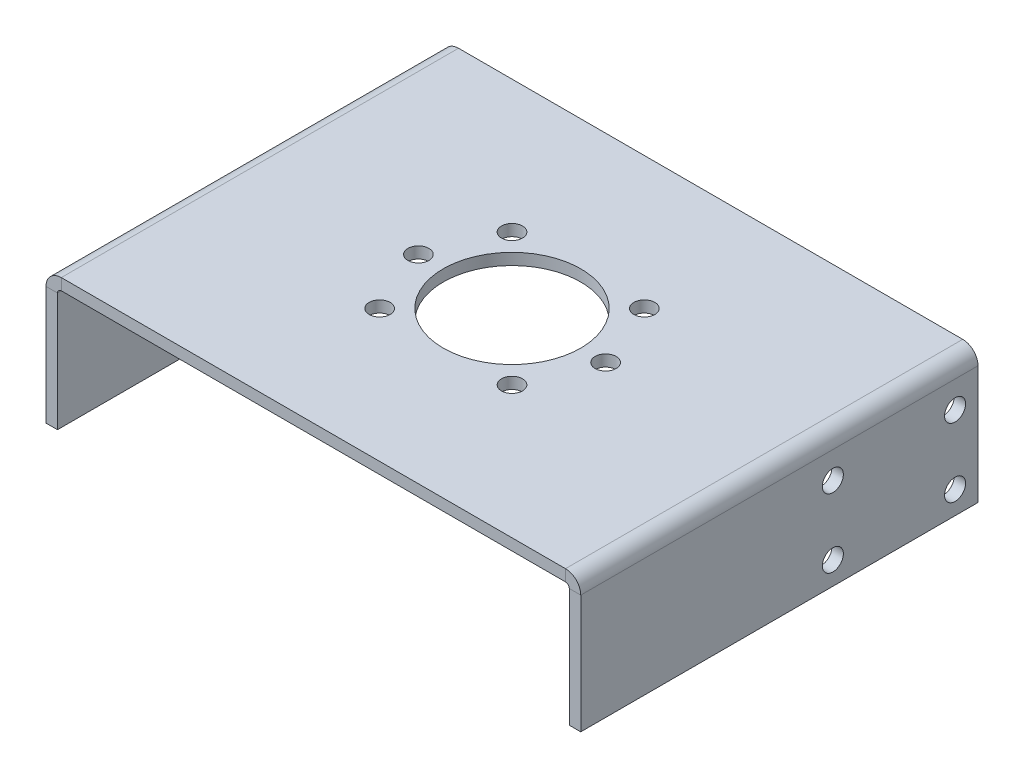
ISO-10303-21;
HEADER;
FILE_DESCRIPTION(('STEP AP214'),'2;1');
FILE_NAME('part.step','',(''),(''),'','','');
FILE_SCHEMA(('AUTOMOTIVE_DESIGN { 1 0 10303 214 1 1 1 1 }'));
ENDSEC;
DATA;
#1=APPLICATION_CONTEXT('core data for automotive mechanical design processes');
#2=APPLICATION_PROTOCOL_DEFINITION('international standard','automotive_design',2000,#1);
#3=PRODUCT_CONTEXT('',#1,'mechanical');
#4=PRODUCT('Part','Part','',(#3));
#5=PRODUCT_RELATED_PRODUCT_CATEGORY('part','',(#4));
#6=PRODUCT_DEFINITION_FORMATION('','',#4);
#7=PRODUCT_DEFINITION_CONTEXT('part definition',#1,'design');
#8=PRODUCT_DEFINITION('design','',#6,#7);
#9=PRODUCT_DEFINITION_SHAPE('','',#8);
#10=(LENGTH_UNIT() NAMED_UNIT(*) SI_UNIT(.MILLI.,.METRE.));
#11=(NAMED_UNIT(*) PLANE_ANGLE_UNIT() SI_UNIT($,.RADIAN.));
#12=(NAMED_UNIT(*) SI_UNIT($,.STERADIAN.) SOLID_ANGLE_UNIT());
#13=UNCERTAINTY_MEASURE_WITH_UNIT(LENGTH_MEASURE(1.E-05),#10,'distance_accuracy_value','');
#14=(GEOMETRIC_REPRESENTATION_CONTEXT(3) GLOBAL_UNCERTAINTY_ASSIGNED_CONTEXT((#13)) GLOBAL_UNIT_ASSIGNED_CONTEXT((#10,
#11,#12)) REPRESENTATION_CONTEXT('',''));
#15=CARTESIAN_POINT('',(0.,0.,0.));
#16=DIRECTION('',(0.,0.,1.));
#17=DIRECTION('',(1.,0.,0.));
#18=AXIS2_PLACEMENT_3D('',#15,#16,#17);
#19=CARTESIAN_POINT('',(-66.,0.,104.));
#20=DIRECTION('',(0.,0.,1.));
#21=DIRECTION('',(1.,0.,0.));
#22=AXIS2_PLACEMENT_3D('',#19,#20,#21);
#23=PLANE('',#22);
#24=DIRECTION('',(0.,-1.,0.));
#25=VECTOR('',#24,1.);
#26=CARTESIAN_POINT('',(-66.,0.,104.));
#27=LINE('',#26,#25);
#28=CARTESIAN_POINT('',(-66.,0.,104.));
#29=VERTEX_POINT('',#28);
#30=CARTESIAN_POINT('',(-66.,-3.,104.));
#31=VERTEX_POINT('',#30);
#32=EDGE_CURVE('E11',#29,#31,#27,.T.);
#33=ORIENTED_EDGE('',*,*,#32,.F.);
#34=CARTESIAN_POINT('',(-66.,-4.,104.));
#35=DIRECTION('',(0.,0.,1.));
#36=DIRECTION('',(1.,0.,0.));
#37=AXIS2_PLACEMENT_3D('',#34,#35,#36);
#38=CIRCLE('',#37,4.);
#39=CARTESIAN_POINT('',(-70.,-4.,104.));
#40=VERTEX_POINT('',#39);
#41=EDGE_CURVE('E251',#40,#29,#38,.F.);
#42=ORIENTED_EDGE('',*,*,#41,.F.);
#43=DIRECTION('',(-1.,0.,0.));
#44=VECTOR('',#43,1.);
#45=CARTESIAN_POINT('',(-67.,-4.,104.));
#46=LINE('',#45,#44);
#47=CARTESIAN_POINT('',(-67.,-4.,104.));
#48=VERTEX_POINT('',#47);
#49=EDGE_CURVE('E48',#48,#40,#46,.T.);
#50=ORIENTED_EDGE('',*,*,#49,.F.);
#51=CARTESIAN_POINT('',(-66.,-4.,104.));
#52=DIRECTION('',(0.,0.,1.));
#53=DIRECTION('',(1.,0.,0.));
#54=AXIS2_PLACEMENT_3D('',#51,#52,#53);
#55=CIRCLE('',#54,1.);
#56=EDGE_CURVE('E149',#48,#31,#55,.F.);
#57=ORIENTED_EDGE('',*,*,#56,.T.);
#58=EDGE_LOOP('',(#33,#42,#50,#57));
#59=FACE_BOUND('',#58,.T.);
#60=ADVANCED_FACE('F40',(#59),#23,.T.);
#61=CARTESIAN_POINT('',(-67.,-4.,104.));
#62=DIRECTION('',(0.,0.,1.));
#63=DIRECTION('',(1.,0.,0.));
#64=AXIS2_PLACEMENT_3D('',#61,#62,#63);
#65=PLANE('',#64);
#66=DIRECTION('',(1.,0.,0.));
#67=VECTOR('',#66,1.);
#68=CARTESIAN_POINT('',(-70.,0.,104.));
#69=LINE('',#68,#67);
#70=CARTESIAN_POINT('',(66.,0.,104.));
#71=VERTEX_POINT('',#70);
#72=EDGE_CURVE('E143',#29,#71,#69,.T.);
#73=ORIENTED_EDGE('',*,*,#72,.F.);
#74=ORIENTED_EDGE('',*,*,#32,.T.);
#75=DIRECTION('',(1.,0.,0.));
#76=VECTOR('',#75,1.);
#77=CARTESIAN_POINT('',(-70.,-3.,104.));
#78=LINE('',#77,#76);
#79=CARTESIAN_POINT('',(66.,-3.,104.));
#80=VERTEX_POINT('',#79);
#81=EDGE_CURVE('E140',#31,#80,#78,.T.);
#82=ORIENTED_EDGE('',*,*,#81,.T.);
#83=DIRECTION('',(0.,1.,0.));
#84=VECTOR('',#83,1.);
#85=CARTESIAN_POINT('',(66.,-3.,104.));
#86=LINE('',#85,#84);
#87=EDGE_CURVE('E232',#80,#71,#86,.T.);
#88=ORIENTED_EDGE('',*,*,#87,.T.);
#89=EDGE_LOOP('',(#73,#74,#82,#88));
#90=FACE_BOUND('',#89,.T.);
#91=ADVANCED_FACE('F138',(#90),#65,.T.);
#92=CARTESIAN_POINT('',(-70.,-4.,0.));
#93=DIRECTION('',(0.,0.,-1.));
#94=DIRECTION('',(-1.,0.,0.));
#95=AXIS2_PLACEMENT_3D('',#92,#93,#94);
#96=PLANE('',#95);
#97=DIRECTION('',(1.,0.,0.));
#98=VECTOR('',#97,1.);
#99=CARTESIAN_POINT('',(-70.,-4.,0.));
#100=LINE('',#99,#98);
#101=CARTESIAN_POINT('',(-70.,-4.,0.));
#102=VERTEX_POINT('',#101);
#103=CARTESIAN_POINT('',(-67.,-4.,0.));
#104=VERTEX_POINT('',#103);
#105=EDGE_CURVE('E237',#102,#104,#100,.T.);
#106=ORIENTED_EDGE('',*,*,#105,.F.);
#107=CARTESIAN_POINT('',(-66.,-4.,0.));
#108=DIRECTION('',(0.,0.,1.));
#109=DIRECTION('',(1.,0.,0.));
#110=AXIS2_PLACEMENT_3D('',#107,#108,#109);
#111=CIRCLE('',#110,4.);
#112=CARTESIAN_POINT('',(-66.,0.,0.));
#113=VERTEX_POINT('',#112);
#114=EDGE_CURVE('E189',#102,#113,#111,.F.);
#115=ORIENTED_EDGE('',*,*,#114,.T.);
#116=DIRECTION('',(0.,1.,0.));
#117=VECTOR('',#116,1.);
#118=CARTESIAN_POINT('',(-66.,-3.,0.));
#119=LINE('',#118,#117);
#120=CARTESIAN_POINT('',(-66.,-3.,0.));
#121=VERTEX_POINT('',#120);
#122=EDGE_CURVE('E235',#121,#113,#119,.T.);
#123=ORIENTED_EDGE('',*,*,#122,.F.);
#124=CARTESIAN_POINT('',(-66.,-4.,0.));
#125=DIRECTION('',(0.,0.,1.));
#126=DIRECTION('',(1.,0.,0.));
#127=AXIS2_PLACEMENT_3D('',#124,#125,#126);
#128=CIRCLE('',#127,1.);
#129=EDGE_CURVE('E161',#104,#121,#128,.F.);
#130=ORIENTED_EDGE('',*,*,#129,.F.);
#131=EDGE_LOOP('',(#106,#115,#123,#130));
#132=FACE_BOUND('',#131,.T.);
#133=ADVANCED_FACE('F391',(#132),#96,.T.);
#134=CARTESIAN_POINT('',(-66.,-3.,0.));
#135=DIRECTION('',(0.,0.,-1.));
#136=DIRECTION('',(-1.,0.,0.));
#137=AXIS2_PLACEMENT_3D('',#134,#135,#136);
#138=PLANE('',#137);
#139=DIRECTION('',(0.,1.,0.));
#140=VECTOR('',#139,1.);
#141=CARTESIAN_POINT('',(-70.,0.,0.));
#142=LINE('',#141,#140);
#143=CARTESIAN_POINT('',(-70.,-35.,0.));
#144=VERTEX_POINT('',#143);
#145=EDGE_CURVE('E192',#144,#102,#142,.T.);
#146=ORIENTED_EDGE('',*,*,#145,.T.);
#147=ORIENTED_EDGE('',*,*,#105,.T.);
#148=DIRECTION('',(0.,1.,0.));
#149=VECTOR('',#148,1.);
#150=CARTESIAN_POINT('',(-67.,0.,0.));
#151=LINE('',#150,#149);
#152=CARTESIAN_POINT('',(-67.,-35.,0.));
#153=VERTEX_POINT('',#152);
#154=EDGE_CURVE('E198',#153,#104,#151,.T.);
#155=ORIENTED_EDGE('',*,*,#154,.F.);
#156=DIRECTION('',(-1.,0.,0.));
#157=VECTOR('',#156,1.);
#158=CARTESIAN_POINT('',(-67.,-35.,0.));
#159=LINE('',#158,#157);
#160=EDGE_CURVE('E195',#153,#144,#159,.T.);
#161=ORIENTED_EDGE('',*,*,#160,.T.);
#162=EDGE_LOOP('',(#146,#147,#155,#161));
#163=FACE_BOUND('',#162,.T.);
#164=ADVANCED_FACE('F394',(#163),#138,.T.);
#165=CARTESIAN_POINT('',(70.,-4.,104.));
#166=DIRECTION('',(0.,0.,1.));
#167=DIRECTION('',(1.,0.,0.));
#168=AXIS2_PLACEMENT_3D('',#165,#166,#167);
#169=PLANE('',#168);
#170=DIRECTION('',(-1.,0.,0.));
#171=VECTOR('',#170,1.);
#172=CARTESIAN_POINT('',(70.,-4.,104.));
#173=LINE('',#172,#171);
#174=CARTESIAN_POINT('',(70.,-4.,104.));
#175=VERTEX_POINT('',#174);
#176=CARTESIAN_POINT('',(67.,-4.,104.));
#177=VERTEX_POINT('',#176);
#178=EDGE_CURVE('E56',#175,#177,#173,.T.);
#179=ORIENTED_EDGE('',*,*,#178,.F.);
#180=CARTESIAN_POINT('',(66.,-4.,104.));
#181=DIRECTION('',(0.,0.,1.));
#182=DIRECTION('',(1.,0.,0.));
#183=AXIS2_PLACEMENT_3D('',#180,#181,#182);
#184=CIRCLE('',#183,4.);
#185=EDGE_CURVE('E261',#71,#175,#184,.F.);
#186=ORIENTED_EDGE('',*,*,#185,.F.);
#187=ORIENTED_EDGE('',*,*,#87,.F.);
#188=CARTESIAN_POINT('',(66.,-4.,104.));
#189=DIRECTION('',(0.,0.,1.));
#190=DIRECTION('',(1.,0.,0.));
#191=AXIS2_PLACEMENT_3D('',#188,#189,#190);
#192=CIRCLE('',#191,1.);
#193=EDGE_CURVE('E169',#80,#177,#192,.F.);
#194=ORIENTED_EDGE('',*,*,#193,.T.);
#195=EDGE_LOOP('',(#179,#186,#187,#194));
#196=FACE_BOUND('',#195,.T.);
#197=ADVANCED_FACE('F421',(#196),#169,.T.);
#198=CARTESIAN_POINT('',(66.,-3.,104.));
#199=DIRECTION('',(0.,0.,1.));
#200=DIRECTION('',(1.,0.,0.));
#201=AXIS2_PLACEMENT_3D('',#198,#199,#200);
#202=PLANE('',#201);
#203=DIRECTION('',(0.,-1.,0.));
#204=VECTOR('',#203,1.);
#205=CARTESIAN_POINT('',(70.,0.,104.));
#206=LINE('',#205,#204);
#207=CARTESIAN_POINT('',(70.,-35.,104.));
#208=VERTEX_POINT('',#207);
#209=EDGE_CURVE('E264',#175,#208,#206,.T.);
#210=ORIENTED_EDGE('',*,*,#209,.F.);
#211=ORIENTED_EDGE('',*,*,#178,.T.);
#212=DIRECTION('',(0.,-1.,0.));
#213=VECTOR('',#212,1.);
#214=CARTESIAN_POINT('',(67.,0.,104.));
#215=LINE('',#214,#213);
#216=CARTESIAN_POINT('',(67.,-35.,104.));
#217=VERTEX_POINT('',#216);
#218=EDGE_CURVE('E110',#177,#217,#215,.T.);
#219=ORIENTED_EDGE('',*,*,#218,.T.);
#220=DIRECTION('',(-1.,0.,0.));
#221=VECTOR('',#220,1.);
#222=CARTESIAN_POINT('',(70.,-35.,104.));
#223=LINE('',#222,#221);
#224=EDGE_CURVE('E267',#208,#217,#223,.T.);
#225=ORIENTED_EDGE('',*,*,#224,.F.);
#226=EDGE_LOOP('',(#210,#211,#219,#225));
#227=FACE_BOUND('',#226,.T.);
#228=ADVANCED_FACE('F424',(#227),#202,.T.);
#229=CARTESIAN_POINT('',(66.,0.,0.));
#230=DIRECTION('',(0.,0.,-1.));
#231=DIRECTION('',(-1.,0.,0.));
#232=AXIS2_PLACEMENT_3D('',#229,#230,#231);
#233=PLANE('',#232);
#234=DIRECTION('',(0.,-1.,0.));
#235=VECTOR('',#234,1.);
#236=CARTESIAN_POINT('',(66.,0.,0.));
#237=LINE('',#236,#235);
#238=CARTESIAN_POINT('',(66.,0.,0.));
#239=VERTEX_POINT('',#238);
#240=CARTESIAN_POINT('',(66.,-3.,0.));
#241=VERTEX_POINT('',#240);
#242=EDGE_CURVE('E97',#239,#241,#237,.T.);
#243=ORIENTED_EDGE('',*,*,#242,.F.);
#244=CARTESIAN_POINT('',(66.,-4.,0.));
#245=DIRECTION('',(0.,0.,1.));
#246=DIRECTION('',(1.,0.,0.));
#247=AXIS2_PLACEMENT_3D('',#244,#245,#246);
#248=CIRCLE('',#247,4.);
#249=CARTESIAN_POINT('',(70.,-4.,0.));
#250=VERTEX_POINT('',#249);
#251=EDGE_CURVE('E185',#239,#250,#248,.F.);
#252=ORIENTED_EDGE('',*,*,#251,.T.);
#253=DIRECTION('',(1.,0.,0.));
#254=VECTOR('',#253,1.);
#255=CARTESIAN_POINT('',(67.,-4.,0.));
#256=LINE('',#255,#254);
#257=CARTESIAN_POINT('',(67.,-4.,0.));
#258=VERTEX_POINT('',#257);
#259=EDGE_CURVE('E104',#258,#250,#256,.T.);
#260=ORIENTED_EDGE('',*,*,#259,.F.);
#261=CARTESIAN_POINT('',(66.,-4.,0.));
#262=DIRECTION('',(0.,0.,1.));
#263=DIRECTION('',(1.,0.,0.));
#264=AXIS2_PLACEMENT_3D('',#261,#262,#263);
#265=CIRCLE('',#264,1.);
#266=EDGE_CURVE('E204',#241,#258,#265,.F.);
#267=ORIENTED_EDGE('',*,*,#266,.F.);
#268=EDGE_LOOP('',(#243,#252,#260,#267));
#269=FACE_BOUND('',#268,.T.);
#270=ADVANCED_FACE('F428',(#269),#233,.T.);
#271=CARTESIAN_POINT('',(67.,-4.,0.));
#272=DIRECTION('',(0.,0.,-1.));
#273=DIRECTION('',(-1.,0.,0.));
#274=AXIS2_PLACEMENT_3D('',#271,#272,#273);
#275=PLANE('',#274);
#276=DIRECTION('',(1.,0.,0.));
#277=VECTOR('',#276,1.);
#278=CARTESIAN_POINT('',(-70.,0.,0.));
#279=LINE('',#278,#277);
#280=EDGE_CURVE('E187',#113,#239,#279,.T.);
#281=ORIENTED_EDGE('',*,*,#280,.T.);
#282=ORIENTED_EDGE('',*,*,#242,.T.);
#283=DIRECTION('',(1.,0.,0.));
#284=VECTOR('',#283,1.);
#285=CARTESIAN_POINT('',(-70.,-3.,0.));
#286=LINE('',#285,#284);
#287=EDGE_CURVE('E202',#121,#241,#286,.T.);
#288=ORIENTED_EDGE('',*,*,#287,.F.);
#289=ORIENTED_EDGE('',*,*,#122,.T.);
#290=EDGE_LOOP('',(#281,#282,#288,#289));
#291=FACE_BOUND('',#290,.T.);
#292=ADVANCED_FACE('F431',(#291),#275,.T.);
#293=CARTESIAN_POINT('',(67.,0.,104.));
#294=DIRECTION('',(1.,0.,0.));
#295=DIRECTION('',(0.,1.,0.));
#296=AXIS2_PLACEMENT_3D('',#293,#294,#295);
#297=PLANE('',#296);
#298=CARTESIAN_POINT('',(67.,-29.,6.));
#299=DIRECTION('',(-1.,0.,0.));
#300=DIRECTION('',(0.,-1.,0.));
#301=AXIS2_PLACEMENT_3D('',#298,#299,#300);
#302=CIRCLE('',#301,2.75000000000001);
#303=CARTESIAN_POINT('',(67.,-31.75,6.));
#304=VERTEX_POINT('',#303);
#305=EDGE_CURVE('E340',#304,#304,#302,.T.);
#306=ORIENTED_EDGE('',*,*,#305,.F.);
#307=EDGE_LOOP('',(#306));
#308=FACE_BOUND('',#307,.T.);
#309=CARTESIAN_POINT('',(67.,-11.,6.));
#310=DIRECTION('',(-1.,0.,0.));
#311=DIRECTION('',(0.,-1.,0.));
#312=AXIS2_PLACEMENT_3D('',#309,#310,#311);
#313=CIRCLE('',#312,2.75000000000001);
#314=CARTESIAN_POINT('',(67.,-13.75,6.));
#315=VERTEX_POINT('',#314);
#316=EDGE_CURVE('E347',#315,#315,#313,.T.);
#317=ORIENTED_EDGE('',*,*,#316,.F.);
#318=EDGE_LOOP('',(#317));
#319=FACE_BOUND('',#318,.T.);
#320=CARTESIAN_POINT('',(67.,-11.,38.));
#321=DIRECTION('',(-1.,0.,0.));
#322=DIRECTION('',(0.,-1.,0.));
#323=AXIS2_PLACEMENT_3D('',#320,#321,#322);
#324=CIRCLE('',#323,2.75000000000001);
#325=CARTESIAN_POINT('',(67.,-13.75,38.));
#326=VERTEX_POINT('',#325);
#327=EDGE_CURVE('E334',#326,#326,#324,.T.);
#328=ORIENTED_EDGE('',*,*,#327,.F.);
#329=EDGE_LOOP('',(#328));
#330=FACE_BOUND('',#329,.T.);
#331=CARTESIAN_POINT('',(67.,-29.,38.));
#332=DIRECTION('',(-1.,0.,0.));
#333=DIRECTION('',(0.,-1.,0.));
#334=AXIS2_PLACEMENT_3D('',#331,#332,#333);
#335=CIRCLE('',#334,2.75000000000001);
#336=CARTESIAN_POINT('',(67.,-31.75,38.));
#337=VERTEX_POINT('',#336);
#338=EDGE_CURVE('E317',#337,#337,#335,.T.);
#339=ORIENTED_EDGE('',*,*,#338,.F.);
#340=EDGE_LOOP('',(#339));
#341=FACE_BOUND('',#340,.T.);
#342=DIRECTION('',(0.,-1.,0.));
#343=VECTOR('',#342,1.);
#344=CARTESIAN_POINT('',(67.,0.,0.));
#345=LINE('',#344,#343);
#346=CARTESIAN_POINT('',(67.,-35.,0.));
#347=VERTEX_POINT('',#346);
#348=EDGE_CURVE('E175',#258,#347,#345,.T.);
#349=ORIENTED_EDGE('',*,*,#348,.T.);
#350=DIRECTION('',(0.,0.,-1.));
#351=VECTOR('',#350,1.);
#352=CARTESIAN_POINT('',(67.,-35.,104.));
#353=LINE('',#352,#351);
#354=EDGE_CURVE('E228',#217,#347,#353,.T.);
#355=ORIENTED_EDGE('',*,*,#354,.F.);
#356=ORIENTED_EDGE('',*,*,#218,.F.);
#357=DIRECTION('',(0.,0.,-1.));
#358=VECTOR('',#357,1.);
#359=CARTESIAN_POINT('',(67.,-4.,104.));
#360=LINE('',#359,#358);
#361=EDGE_CURVE('E171',#177,#258,#360,.T.);
#362=ORIENTED_EDGE('',*,*,#361,.T.);
#363=EDGE_LOOP('',(#349,#355,#356,#362));
#364=FACE_BOUND('',#363,.T.);
#365=ADVANCED_FACE('F434',(#308,#319,#330,#341,#364),#297,.F.);
#366=CARTESIAN_POINT('',(70.,-35.,104.));
#367=DIRECTION('',(0.,-1.,0.));
#368=DIRECTION('',(0.,0.,-1.));
#369=AXIS2_PLACEMENT_3D('',#366,#367,#368);
#370=PLANE('',#369);
#371=DIRECTION('',(-1.,0.,0.));
#372=VECTOR('',#371,1.);
#373=CARTESIAN_POINT('',(70.,-35.,0.));
#374=LINE('',#373,#372);
#375=CARTESIAN_POINT('',(70.,-35.,0.));
#376=VERTEX_POINT('',#375);
#377=EDGE_CURVE('E178',#376,#347,#374,.T.);
#378=ORIENTED_EDGE('',*,*,#377,.F.);
#379=DIRECTION('',(0.,0.,-1.));
#380=VECTOR('',#379,1.);
#381=CARTESIAN_POINT('',(70.,-35.,104.));
#382=LINE('',#381,#380);
#383=EDGE_CURVE('E226',#208,#376,#382,.T.);
#384=ORIENTED_EDGE('',*,*,#383,.F.);
#385=ORIENTED_EDGE('',*,*,#224,.T.);
#386=ORIENTED_EDGE('',*,*,#354,.T.);
#387=EDGE_LOOP('',(#378,#384,#385,#386));
#388=FACE_BOUND('',#387,.T.);
#389=ADVANCED_FACE('F437',(#388),#370,.T.);
#390=CARTESIAN_POINT('',(70.,0.,104.));
#391=DIRECTION('',(1.,0.,0.));
#392=DIRECTION('',(0.,1.,0.));
#393=AXIS2_PLACEMENT_3D('',#390,#391,#392);
#394=PLANE('',#393);
#395=CARTESIAN_POINT('',(70.,-29.,6.));
#396=DIRECTION('',(-1.,0.,0.));
#397=DIRECTION('',(0.,-1.,0.));
#398=AXIS2_PLACEMENT_3D('',#395,#396,#397);
#399=CIRCLE('',#398,2.75000000000001);
#400=CARTESIAN_POINT('',(70.,-31.75,6.));
#401=VERTEX_POINT('',#400);
#402=EDGE_CURVE('E337',#401,#401,#399,.T.);
#403=ORIENTED_EDGE('',*,*,#402,.T.);
#404=EDGE_LOOP('',(#403));
#405=FACE_BOUND('',#404,.T.);
#406=CARTESIAN_POINT('',(70.,-11.,6.));
#407=DIRECTION('',(-1.,0.,0.));
#408=DIRECTION('',(0.,-1.,0.));
#409=AXIS2_PLACEMENT_3D('',#406,#407,#408);
#410=CIRCLE('',#409,2.75000000000001);
#411=CARTESIAN_POINT('',(70.,-13.75,6.));
#412=VERTEX_POINT('',#411);
#413=EDGE_CURVE('E344',#412,#412,#410,.T.);
#414=ORIENTED_EDGE('',*,*,#413,.T.);
#415=EDGE_LOOP('',(#414));
#416=FACE_BOUND('',#415,.T.);
#417=CARTESIAN_POINT('',(70.,-11.,38.));
#418=DIRECTION('',(-1.,0.,0.));
#419=DIRECTION('',(0.,-1.,0.));
#420=AXIS2_PLACEMENT_3D('',#417,#418,#419);
#421=CIRCLE('',#420,2.75000000000001);
#422=CARTESIAN_POINT('',(70.,-13.75,38.));
#423=VERTEX_POINT('',#422);
#424=EDGE_CURVE('E350',#423,#423,#421,.T.);
#425=ORIENTED_EDGE('',*,*,#424,.T.);
#426=EDGE_LOOP('',(#425));
#427=FACE_BOUND('',#426,.T.);
#428=CARTESIAN_POINT('',(70.,-29.,38.));
#429=DIRECTION('',(-1.,0.,0.));
#430=DIRECTION('',(0.,-1.,0.));
#431=AXIS2_PLACEMENT_3D('',#428,#429,#430);
#432=CIRCLE('',#431,2.75000000000001);
#433=CARTESIAN_POINT('',(70.,-31.75,38.));
#434=VERTEX_POINT('',#433);
#435=EDGE_CURVE('E331',#434,#434,#432,.T.);
#436=ORIENTED_EDGE('',*,*,#435,.T.);
#437=EDGE_LOOP('',(#436));
#438=FACE_BOUND('',#437,.T.);
#439=DIRECTION('',(0.,-1.,0.));
#440=VECTOR('',#439,1.);
#441=CARTESIAN_POINT('',(70.,0.,0.));
#442=LINE('',#441,#440);
#443=EDGE_CURVE('E182',#250,#376,#442,.T.);
#444=ORIENTED_EDGE('',*,*,#443,.F.);
#445=DIRECTION('',(0.,0.,-1.));
#446=VECTOR('',#445,1.);
#447=CARTESIAN_POINT('',(70.,-4.,104.));
#448=LINE('',#447,#446);
#449=EDGE_CURVE('E223',#175,#250,#448,.T.);
#450=ORIENTED_EDGE('',*,*,#449,.F.);
#451=ORIENTED_EDGE('',*,*,#209,.T.);
#452=ORIENTED_EDGE('',*,*,#383,.T.);
#453=EDGE_LOOP('',(#444,#450,#451,#452));
#454=FACE_BOUND('',#453,.T.);
#455=ADVANCED_FACE('F441',(#405,#416,#427,#438,#454),#394,.T.);
#456=CARTESIAN_POINT('',(66.,-4.,104.));
#457=DIRECTION('',(0.,0.,-1.));
#458=DIRECTION('',(-1.,0.,0.));
#459=AXIS2_PLACEMENT_3D('',#456,#457,#458);
#460=CYLINDRICAL_SURFACE('',#459,4.);
#461=ORIENTED_EDGE('',*,*,#251,.F.);
#462=DIRECTION('',(0.,0.,-1.));
#463=VECTOR('',#462,1.);
#464=CARTESIAN_POINT('',(66.,0.,104.));
#465=LINE('',#464,#463);
#466=EDGE_CURVE('E220',#71,#239,#465,.T.);
#467=ORIENTED_EDGE('',*,*,#466,.F.);
#468=ORIENTED_EDGE('',*,*,#185,.T.);
#469=ORIENTED_EDGE('',*,*,#449,.T.);
#470=EDGE_LOOP('',(#461,#467,#468,#469));
#471=FACE_BOUND('',#470,.T.);
#472=ADVANCED_FACE('F373',(#471),#460,.T.);
#473=CARTESIAN_POINT('',(-70.,0.,104.));
#474=DIRECTION('',(0.,1.,0.));
#475=DIRECTION('',(0.,0.,1.));
#476=AXIS2_PLACEMENT_3D('',#473,#474,#475);
#477=PLANE('',#476);
#478=CARTESIAN_POINT('',(0.,0.,52.));
#479=DIRECTION('',(0.,1.,0.));
#480=DIRECTION('',(0.,0.,1.));
#481=AXIS2_PLACEMENT_3D('',#478,#479,#480);
#482=CIRCLE('',#481,18.);
#483=CARTESIAN_POINT('',(0.,0.,70.));
#484=VERTEX_POINT('',#483);
#485=EDGE_CURVE('E355',#484,#484,#482,.T.);
#486=ORIENTED_EDGE('',*,*,#485,.F.);
#487=EDGE_LOOP('',(#486));
#488=FACE_BOUND('',#487,.T.);
#489=CARTESIAN_POINT('',(24.5,0.,52.));
#490=DIRECTION('',(0.,1.,0.));
#491=DIRECTION('',(0.,0.,1.));
#492=AXIS2_PLACEMENT_3D('',#489,#490,#491);
#493=CIRCLE('',#492,2.75);
#494=CARTESIAN_POINT('',(24.5,0.,54.75));
#495=VERTEX_POINT('',#494);
#496=EDGE_CURVE('E296',#495,#495,#493,.T.);
#497=ORIENTED_EDGE('',*,*,#496,.F.);
#498=EDGE_LOOP('',(#497));
#499=FACE_BOUND('',#498,.T.);
#500=CARTESIAN_POINT('',(17.3241161390689,0.,34.6758838609298));
#501=DIRECTION('',(0.,1.,0.));
#502=DIRECTION('',(0.,0.,1.));
#503=AXIS2_PLACEMENT_3D('',#500,#501,#502);
#504=CIRCLE('',#503,2.75000000000081);
#505=CARTESIAN_POINT('',(17.3241161390689,0.,37.4258838609306));
#506=VERTEX_POINT('',#505);
#507=EDGE_CURVE('E297',#506,#506,#504,.T.);
#508=ORIENTED_EDGE('',*,*,#507,.F.);
#509=EDGE_LOOP('',(#508));
#510=FACE_BOUND('',#509,.T.);
#511=CARTESIAN_POINT('',(-17.3241161390726,0.,34.6758838609325));
#512=DIRECTION('',(0.,1.,0.));
#513=DIRECTION('',(0.,0.,1.));
#514=AXIS2_PLACEMENT_3D('',#511,#512,#513);
#515=CIRCLE('',#514,2.74999999999936);
#516=CARTESIAN_POINT('',(-17.3241161390726,0.,37.4258838609319));
#517=VERTEX_POINT('',#516);
#518=EDGE_CURVE('E271',#517,#517,#515,.T.);
#519=ORIENTED_EDGE('',*,*,#518,.F.);
#520=EDGE_LOOP('',(#519));
#521=FACE_BOUND('',#520,.T.);
#522=CARTESIAN_POINT('',(-24.500000000001,0.,52.0000000000039));
#523=DIRECTION('',(0.,1.,0.));
#524=DIRECTION('',(0.,0.,1.));
#525=AXIS2_PLACEMENT_3D('',#522,#523,#524);
#526=CIRCLE('',#525,2.74999999999786);
#527=CARTESIAN_POINT('',(-24.500000000001,0.,54.7500000000017));
#528=VERTEX_POINT('',#527);
#529=EDGE_CURVE('E278',#528,#528,#526,.T.);
#530=ORIENTED_EDGE('',*,*,#529,.F.);
#531=EDGE_LOOP('',(#530));
#532=FACE_BOUND('',#531,.T.);
#533=CARTESIAN_POINT('',(-17.3241161390699,0.,69.3241161390741));
#534=DIRECTION('',(0.,1.,0.));
#535=DIRECTION('',(0.,0.,1.));
#536=AXIS2_PLACEMENT_3D('',#533,#534,#535);
#537=CIRCLE('',#536,2.749999999997);
#538=CARTESIAN_POINT('',(-17.3241161390699,0.,72.0741161390711));
#539=VERTEX_POINT('',#538);
#540=EDGE_CURVE('E284',#539,#539,#537,.T.);
#541=ORIENTED_EDGE('',*,*,#540,.F.);
#542=EDGE_LOOP('',(#541));
#543=FACE_BOUND('',#542,.T.);
#544=CARTESIAN_POINT('',(17.3241161390716,0.,69.3241161390713));
#545=DIRECTION('',(0.,1.,0.));
#546=DIRECTION('',(0.,0.,1.));
#547=AXIS2_PLACEMENT_3D('',#544,#545,#546);
#548=CIRCLE('',#547,2.74999999999848);
#549=CARTESIAN_POINT('',(17.3241161390716,0.,72.0741161390698));
#550=VERTEX_POINT('',#549);
#551=EDGE_CURVE('E290',#550,#550,#548,.T.);
#552=ORIENTED_EDGE('',*,*,#551,.F.);
#553=EDGE_LOOP('',(#552));
#554=FACE_BOUND('',#553,.T.);
#555=ORIENTED_EDGE('',*,*,#280,.F.);
#556=DIRECTION('',(0.,0.,-1.));
#557=VECTOR('',#556,1.);
#558=CARTESIAN_POINT('',(-66.,0.,104.));
#559=LINE('',#558,#557);
#560=EDGE_CURVE('E217',#29,#113,#559,.T.);
#561=ORIENTED_EDGE('',*,*,#560,.F.);
#562=ORIENTED_EDGE('',*,*,#72,.T.);
#563=ORIENTED_EDGE('',*,*,#466,.T.);
#564=EDGE_LOOP('',(#555,#561,#562,#563));
#565=FACE_BOUND('',#564,.T.);
#566=ADVANCED_FACE('F370',(#488,#499,#510,#521,#532,#543,#554,#565),#477,.T.);
#567=CARTESIAN_POINT('',(-66.,-4.,104.));
#568=DIRECTION('',(0.,0.,-1.));
#569=DIRECTION('',(-1.,0.,0.));
#570=AXIS2_PLACEMENT_3D('',#567,#568,#569);
#571=CYLINDRICAL_SURFACE('',#570,4.);
#572=ORIENTED_EDGE('',*,*,#114,.F.);
#573=DIRECTION('',(0.,0.,-1.));
#574=VECTOR('',#573,1.);
#575=CARTESIAN_POINT('',(-70.,-4.,104.));
#576=LINE('',#575,#574);
#577=EDGE_CURVE('E214',#40,#102,#576,.T.);
#578=ORIENTED_EDGE('',*,*,#577,.F.);
#579=ORIENTED_EDGE('',*,*,#41,.T.);
#580=ORIENTED_EDGE('',*,*,#560,.T.);
#581=EDGE_LOOP('',(#572,#578,#579,#580));
#582=FACE_BOUND('',#581,.T.);
#583=ADVANCED_FACE('F250',(#582),#571,.T.);
#584=CARTESIAN_POINT('',(-70.,0.,104.));
#585=DIRECTION('',(-1.,0.,0.));
#586=DIRECTION('',(0.,-1.,0.));
#587=AXIS2_PLACEMENT_3D('',#584,#585,#586);
#588=PLANE('',#587);
#589=CARTESIAN_POINT('',(-70.,-29.,6.));
#590=DIRECTION('',(-1.,0.,0.));
#591=DIRECTION('',(0.,-1.,0.));
#592=AXIS2_PLACEMENT_3D('',#589,#590,#591);
#593=CIRCLE('',#592,2.75000000000001);
#594=CARTESIAN_POINT('',(-70.,-31.75,6.));
#595=VERTEX_POINT('',#594);
#596=EDGE_CURVE('E313',#595,#595,#593,.T.);
#597=ORIENTED_EDGE('',*,*,#596,.F.);
#598=EDGE_LOOP('',(#597));
#599=FACE_BOUND('',#598,.T.);
#600=CARTESIAN_POINT('',(-70.,-11.,6.));
#601=DIRECTION('',(-1.,0.,0.));
#602=DIRECTION('',(0.,-1.,0.));
#603=AXIS2_PLACEMENT_3D('',#600,#601,#602);
#604=CIRCLE('',#603,2.75000000000001);
#605=CARTESIAN_POINT('',(-70.,-13.75,6.));
#606=VERTEX_POINT('',#605);
#607=EDGE_CURVE('E320',#606,#606,#604,.T.);
#608=ORIENTED_EDGE('',*,*,#607,.F.);
#609=EDGE_LOOP('',(#608));
#610=FACE_BOUND('',#609,.T.);
#611=CARTESIAN_POINT('',(-70.,-11.,38.));
#612=DIRECTION('',(-1.,0.,0.));
#613=DIRECTION('',(0.,-1.,0.));
#614=AXIS2_PLACEMENT_3D('',#611,#612,#613);
#615=CIRCLE('',#614,2.75000000000001);
#616=CARTESIAN_POINT('',(-70.,-13.75,38.));
#617=VERTEX_POINT('',#616);
#618=EDGE_CURVE('E326',#617,#617,#615,.T.);
#619=ORIENTED_EDGE('',*,*,#618,.F.);
#620=EDGE_LOOP('',(#619));
#621=FACE_BOUND('',#620,.T.);
#622=CARTESIAN_POINT('',(-70.,-29.,38.));
#623=DIRECTION('',(-1.,0.,0.));
#624=DIRECTION('',(0.,-1.,0.));
#625=AXIS2_PLACEMENT_3D('',#622,#623,#624);
#626=CIRCLE('',#625,2.75000000000001);
#627=CARTESIAN_POINT('',(-70.,-31.75,38.));
#628=VERTEX_POINT('',#627);
#629=EDGE_CURVE('E307',#628,#628,#626,.T.);
#630=ORIENTED_EDGE('',*,*,#629,.F.);
#631=EDGE_LOOP('',(#630));
#632=FACE_BOUND('',#631,.T.);
#633=ORIENTED_EDGE('',*,*,#145,.F.);
#634=DIRECTION('',(0.,0.,-1.));
#635=VECTOR('',#634,1.);
#636=CARTESIAN_POINT('',(-70.,-35.,104.));
#637=LINE('',#636,#635);
#638=CARTESIAN_POINT('',(-70.,-35.,104.));
#639=VERTEX_POINT('',#638);
#640=EDGE_CURVE('E212',#639,#144,#637,.T.);
#641=ORIENTED_EDGE('',*,*,#640,.F.);
#642=DIRECTION('',(0.,1.,0.));
#643=VECTOR('',#642,1.);
#644=CARTESIAN_POINT('',(-70.,0.,104.));
#645=LINE('',#644,#643);
#646=EDGE_CURVE('E244',#639,#40,#645,.T.);
#647=ORIENTED_EDGE('',*,*,#646,.T.);
#648=ORIENTED_EDGE('',*,*,#577,.T.);
#649=EDGE_LOOP('',(#633,#641,#647,#648));
#650=FACE_BOUND('',#649,.T.);
#651=ADVANCED_FACE('F255',(#599,#610,#621,#632,#650),#588,.T.);
#652=CARTESIAN_POINT('',(-67.,-35.,104.));
#653=DIRECTION('',(0.,-1.,0.));
#654=DIRECTION('',(0.,0.,-1.));
#655=AXIS2_PLACEMENT_3D('',#652,#653,#654);
#656=PLANE('',#655);
#657=ORIENTED_EDGE('',*,*,#160,.F.);
#658=DIRECTION('',(0.,0.,-1.));
#659=VECTOR('',#658,1.);
#660=CARTESIAN_POINT('',(-67.,-35.,104.));
#661=LINE('',#660,#659);
#662=CARTESIAN_POINT('',(-67.,-35.,104.));
#663=VERTEX_POINT('',#662);
#664=EDGE_CURVE('E210',#663,#153,#661,.T.);
#665=ORIENTED_EDGE('',*,*,#664,.F.);
#666=DIRECTION('',(-1.,0.,0.));
#667=VECTOR('',#666,1.);
#668=CARTESIAN_POINT('',(-67.,-35.,104.));
#669=LINE('',#668,#667);
#670=EDGE_CURVE('E256',#663,#639,#669,.T.);
#671=ORIENTED_EDGE('',*,*,#670,.T.);
#672=ORIENTED_EDGE('',*,*,#640,.T.);
#673=EDGE_LOOP('',(#657,#665,#671,#672));
#674=FACE_BOUND('',#673,.T.);
#675=ADVANCED_FACE('F399',(#674),#656,.T.);
#676=CARTESIAN_POINT('',(-67.,0.,104.));
#677=DIRECTION('',(-1.,0.,0.));
#678=DIRECTION('',(0.,-1.,0.));
#679=AXIS2_PLACEMENT_3D('',#676,#677,#678);
#680=PLANE('',#679);
#681=CARTESIAN_POINT('',(-67.,-29.,6.));
#682=DIRECTION('',(-1.,0.,0.));
#683=DIRECTION('',(0.,-1.,0.));
#684=AXIS2_PLACEMENT_3D('',#681,#682,#683);
#685=CIRCLE('',#684,2.75000000000001);
#686=CARTESIAN_POINT('',(-67.,-31.75,6.));
#687=VERTEX_POINT('',#686);
#688=EDGE_CURVE('E316',#687,#687,#685,.T.);
#689=ORIENTED_EDGE('',*,*,#688,.T.);
#690=EDGE_LOOP('',(#689));
#691=FACE_BOUND('',#690,.T.);
#692=CARTESIAN_POINT('',(-67.,-11.,6.));
#693=DIRECTION('',(-1.,0.,0.));
#694=DIRECTION('',(0.,-1.,0.));
#695=AXIS2_PLACEMENT_3D('',#692,#693,#694);
#696=CIRCLE('',#695,2.75000000000001);
#697=CARTESIAN_POINT('',(-67.,-13.75,6.));
#698=VERTEX_POINT('',#697);
#699=EDGE_CURVE('E323',#698,#698,#696,.T.);
#700=ORIENTED_EDGE('',*,*,#699,.T.);
#701=EDGE_LOOP('',(#700));
#702=FACE_BOUND('',#701,.T.);
#703=CARTESIAN_POINT('',(-67.,-11.,38.));
#704=DIRECTION('',(-1.,0.,0.));
#705=DIRECTION('',(0.,-1.,0.));
#706=AXIS2_PLACEMENT_3D('',#703,#704,#705);
#707=CIRCLE('',#706,2.75000000000001);
#708=CARTESIAN_POINT('',(-67.,-13.75,38.));
#709=VERTEX_POINT('',#708);
#710=EDGE_CURVE('E310',#709,#709,#707,.T.);
#711=ORIENTED_EDGE('',*,*,#710,.T.);
#712=EDGE_LOOP('',(#711));
#713=FACE_BOUND('',#712,.T.);
#714=CARTESIAN_POINT('',(-67.,-29.,38.));
#715=DIRECTION('',(-1.,0.,0.));
#716=DIRECTION('',(0.,-1.,0.));
#717=AXIS2_PLACEMENT_3D('',#714,#715,#716);
#718=CIRCLE('',#717,2.75000000000001);
#719=CARTESIAN_POINT('',(-67.,-31.75,38.));
#720=VERTEX_POINT('',#719);
#721=EDGE_CURVE('E300',#720,#720,#718,.T.);
#722=ORIENTED_EDGE('',*,*,#721,.T.);
#723=EDGE_LOOP('',(#722));
#724=FACE_BOUND('',#723,.T.);
#725=ORIENTED_EDGE('',*,*,#154,.T.);
#726=DIRECTION('',(0.,0.,-1.));
#727=VECTOR('',#726,1.);
#728=CARTESIAN_POINT('',(-67.,-4.,104.));
#729=LINE('',#728,#727);
#730=EDGE_CURVE('E163',#48,#104,#729,.T.);
#731=ORIENTED_EDGE('',*,*,#730,.F.);
#732=DIRECTION('',(0.,1.,0.));
#733=VECTOR('',#732,1.);
#734=CARTESIAN_POINT('',(-67.,0.,104.));
#735=LINE('',#734,#733);
#736=EDGE_CURVE('E154',#663,#48,#735,.T.);
#737=ORIENTED_EDGE('',*,*,#736,.F.);
#738=ORIENTED_EDGE('',*,*,#664,.T.);
#739=EDGE_LOOP('',(#725,#731,#737,#738));
#740=FACE_BOUND('',#739,.T.);
#741=ADVANCED_FACE('F397',(#691,#702,#713,#724,#740),#680,.F.);
#742=CARTESIAN_POINT('',(-66.,-4.,104.));
#743=DIRECTION('',(0.,0.,-1.));
#744=DIRECTION('',(-1.,0.,0.));
#745=AXIS2_PLACEMENT_3D('',#742,#743,#744);
#746=CYLINDRICAL_SURFACE('',#745,1.);
#747=ORIENTED_EDGE('',*,*,#129,.T.);
#748=DIRECTION('',(0.,0.,-1.));
#749=VECTOR('',#748,1.);
#750=CARTESIAN_POINT('',(-66.,-3.,104.));
#751=LINE('',#750,#749);
#752=EDGE_CURVE('E158',#31,#121,#751,.T.);
#753=ORIENTED_EDGE('',*,*,#752,.F.);
#754=ORIENTED_EDGE('',*,*,#56,.F.);
#755=ORIENTED_EDGE('',*,*,#730,.T.);
#756=EDGE_LOOP('',(#747,#753,#754,#755));
#757=FACE_BOUND('',#756,.T.);
#758=ADVANCED_FACE('F159',(#757),#746,.F.);
#759=CARTESIAN_POINT('',(-70.,-3.,104.));
#760=DIRECTION('',(0.,1.,0.));
#761=DIRECTION('',(0.,0.,1.));
#762=AXIS2_PLACEMENT_3D('',#759,#760,#761);
#763=PLANE('',#762);
#764=CARTESIAN_POINT('',(0.,-3.,52.));
#765=DIRECTION('',(0.,1.,0.));
#766=DIRECTION('',(0.,0.,1.));
#767=AXIS2_PLACEMENT_3D('',#764,#765,#766);
#768=CIRCLE('',#767,18.);
#769=CARTESIAN_POINT('',(0.,-3.,70.));
#770=VERTEX_POINT('',#769);
#771=EDGE_CURVE('E341',#770,#770,#768,.T.);
#772=ORIENTED_EDGE('',*,*,#771,.T.);
#773=EDGE_LOOP('',(#772));
#774=FACE_BOUND('',#773,.T.);
#775=CARTESIAN_POINT('',(24.5,-3.,52.));
#776=DIRECTION('',(0.,1.,0.));
#777=DIRECTION('',(0.,0.,1.));
#778=AXIS2_PLACEMENT_3D('',#775,#776,#777);
#779=CIRCLE('',#778,2.75);
#780=CARTESIAN_POINT('',(24.5,-3.,54.75));
#781=VERTEX_POINT('',#780);
#782=EDGE_CURVE('E179',#781,#781,#779,.T.);
#783=ORIENTED_EDGE('',*,*,#782,.T.);
#784=EDGE_LOOP('',(#783));
#785=FACE_BOUND('',#784,.T.);
#786=CARTESIAN_POINT('',(17.3241161390689,-3.,34.6758838609298));
#787=DIRECTION('',(0.,1.,0.));
#788=DIRECTION('',(0.,0.,1.));
#789=AXIS2_PLACEMENT_3D('',#786,#787,#788);
#790=CIRCLE('',#789,2.75000000000081);
#791=CARTESIAN_POINT('',(17.3241161390689,-3.,37.4258838609306));
#792=VERTEX_POINT('',#791);
#793=EDGE_CURVE('E275',#792,#792,#790,.T.);
#794=ORIENTED_EDGE('',*,*,#793,.T.);
#795=EDGE_LOOP('',(#794));
#796=FACE_BOUND('',#795,.T.);
#797=CARTESIAN_POINT('',(-17.3241161390726,-3.,34.6758838609325));
#798=DIRECTION('',(0.,1.,0.));
#799=DIRECTION('',(0.,0.,1.));
#800=AXIS2_PLACEMENT_3D('',#797,#798,#799);
#801=CIRCLE('',#800,2.74999999999936);
#802=CARTESIAN_POINT('',(-17.3241161390726,-3.,37.4258838609319));
#803=VERTEX_POINT('',#802);
#804=EDGE_CURVE('E274',#803,#803,#801,.T.);
#805=ORIENTED_EDGE('',*,*,#804,.T.);
#806=EDGE_LOOP('',(#805));
#807=FACE_BOUND('',#806,.T.);
#808=CARTESIAN_POINT('',(-24.500000000001,-3.,52.0000000000039));
#809=DIRECTION('',(0.,1.,0.));
#810=DIRECTION('',(0.,0.,1.));
#811=AXIS2_PLACEMENT_3D('',#808,#809,#810);
#812=CIRCLE('',#811,2.74999999999786);
#813=CARTESIAN_POINT('',(-24.500000000001,-3.,54.7500000000017));
#814=VERTEX_POINT('',#813);
#815=EDGE_CURVE('E281',#814,#814,#812,.T.);
#816=ORIENTED_EDGE('',*,*,#815,.T.);
#817=EDGE_LOOP('',(#816));
#818=FACE_BOUND('',#817,.T.);
#819=CARTESIAN_POINT('',(-17.3241161390699,-3.,69.3241161390741));
#820=DIRECTION('',(0.,1.,0.));
#821=DIRECTION('',(0.,0.,1.));
#822=AXIS2_PLACEMENT_3D('',#819,#820,#821);
#823=CIRCLE('',#822,2.749999999997);
#824=CARTESIAN_POINT('',(-17.3241161390699,-3.,72.0741161390711));
#825=VERTEX_POINT('',#824);
#826=EDGE_CURVE('E287',#825,#825,#823,.T.);
#827=ORIENTED_EDGE('',*,*,#826,.T.);
#828=EDGE_LOOP('',(#827));
#829=FACE_BOUND('',#828,.T.);
#830=CARTESIAN_POINT('',(17.3241161390716,-3.,69.3241161390713));
#831=DIRECTION('',(0.,1.,0.));
#832=DIRECTION('',(0.,0.,1.));
#833=AXIS2_PLACEMENT_3D('',#830,#831,#832);
#834=CIRCLE('',#833,2.74999999999848);
#835=CARTESIAN_POINT('',(17.3241161390716,-3.,72.0741161390698));
#836=VERTEX_POINT('',#835);
#837=EDGE_CURVE('E293',#836,#836,#834,.T.);
#838=ORIENTED_EDGE('',*,*,#837,.T.);
#839=EDGE_LOOP('',(#838));
#840=FACE_BOUND('',#839,.T.);
#841=ORIENTED_EDGE('',*,*,#287,.T.);
#842=DIRECTION('',(0.,0.,-1.));
#843=VECTOR('',#842,1.);
#844=CARTESIAN_POINT('',(66.,-3.,104.));
#845=LINE('',#844,#843);
#846=EDGE_CURVE('E164',#80,#241,#845,.T.);
#847=ORIENTED_EDGE('',*,*,#846,.F.);
#848=ORIENTED_EDGE('',*,*,#81,.F.);
#849=ORIENTED_EDGE('',*,*,#752,.T.);
#850=EDGE_LOOP('',(#841,#847,#848,#849));
#851=FACE_BOUND('',#850,.T.);
#852=ADVANCED_FACE('F166',(#774,#785,#796,#807,#818,#829,#840,#851),#763,.F.);
#853=CARTESIAN_POINT('',(66.,-4.,104.));
#854=DIRECTION('',(0.,0.,-1.));
#855=DIRECTION('',(-1.,0.,0.));
#856=AXIS2_PLACEMENT_3D('',#853,#854,#855);
#857=CYLINDRICAL_SURFACE('',#856,1.);
#858=ORIENTED_EDGE('',*,*,#266,.T.);
#859=ORIENTED_EDGE('',*,*,#361,.F.);
#860=ORIENTED_EDGE('',*,*,#193,.F.);
#861=ORIENTED_EDGE('',*,*,#846,.T.);
#862=EDGE_LOOP('',(#858,#859,#860,#861));
#863=FACE_BOUND('',#862,.T.);
#864=ADVANCED_FACE('F591',(#863),#857,.F.);
#865=CARTESIAN_POINT('',(66.,-4.,104.));
#866=DIRECTION('',(0.,0.,1.));
#867=DIRECTION('',(1.,0.,0.));
#868=AXIS2_PLACEMENT_3D('',#865,#866,#867);
#869=PLANE('',#868);
#870=ORIENTED_EDGE('',*,*,#736,.T.);
#871=ORIENTED_EDGE('',*,*,#49,.T.);
#872=ORIENTED_EDGE('',*,*,#646,.F.);
#873=ORIENTED_EDGE('',*,*,#670,.F.);
#874=EDGE_LOOP('',(#870,#871,#872,#873));
#875=FACE_BOUND('',#874,.T.);
#876=ADVANCED_FACE('F241',(#875),#869,.T.);
#877=CARTESIAN_POINT('',(66.,-4.,0.));
#878=DIRECTION('',(0.,0.,1.));
#879=DIRECTION('',(1.,0.,0.));
#880=AXIS2_PLACEMENT_3D('',#877,#878,#879);
#881=PLANE('',#880);
#882=ORIENTED_EDGE('',*,*,#348,.F.);
#883=ORIENTED_EDGE('',*,*,#259,.T.);
#884=ORIENTED_EDGE('',*,*,#443,.T.);
#885=ORIENTED_EDGE('',*,*,#377,.T.);
#886=EDGE_LOOP('',(#882,#883,#884,#885));
#887=FACE_BOUND('',#886,.T.);
#888=ADVANCED_FACE('F661',(#887),#881,.F.);
#889=CARTESIAN_POINT('',(17.3241161390716,-3.,69.3241161390713));
#890=DIRECTION('',(0.,1.,0.));
#891=DIRECTION('',(0.,0.,1.));
#892=AXIS2_PLACEMENT_3D('',#889,#890,#891);
#893=CYLINDRICAL_SURFACE('',#892,2.74999999999848);
#894=ORIENTED_EDGE('',*,*,#837,.F.);
#895=EDGE_LOOP('',(#894));
#896=FACE_BOUND('',#895,.T.);
#897=ORIENTED_EDGE('',*,*,#551,.T.);
#898=EDGE_LOOP('',(#897));
#899=FACE_BOUND('',#898,.T.);
#900=ADVANCED_FACE('F651',(#896,#899),#893,.F.);
#901=CARTESIAN_POINT('',(-17.3241161390699,-3.,69.3241161390741));
#902=DIRECTION('',(0.,1.,0.));
#903=DIRECTION('',(0.,0.,1.));
#904=AXIS2_PLACEMENT_3D('',#901,#902,#903);
#905=CYLINDRICAL_SURFACE('',#904,2.749999999997);
#906=ORIENTED_EDGE('',*,*,#826,.F.);
#907=EDGE_LOOP('',(#906));
#908=FACE_BOUND('',#907,.T.);
#909=ORIENTED_EDGE('',*,*,#540,.T.);
#910=EDGE_LOOP('',(#909));
#911=FACE_BOUND('',#910,.T.);
#912=ADVANCED_FACE('F641',(#908,#911),#905,.F.);
#913=CARTESIAN_POINT('',(-24.500000000001,-3.,52.0000000000039));
#914=DIRECTION('',(0.,1.,0.));
#915=DIRECTION('',(0.,0.,1.));
#916=AXIS2_PLACEMENT_3D('',#913,#914,#915);
#917=CYLINDRICAL_SURFACE('',#916,2.74999999999786);
#918=ORIENTED_EDGE('',*,*,#815,.F.);
#919=EDGE_LOOP('',(#918));
#920=FACE_BOUND('',#919,.T.);
#921=ORIENTED_EDGE('',*,*,#529,.T.);
#922=EDGE_LOOP('',(#921));
#923=FACE_BOUND('',#922,.T.);
#924=ADVANCED_FACE('F631',(#920,#923),#917,.F.);
#925=CARTESIAN_POINT('',(-17.3241161390726,-3.,34.6758838609325));
#926=DIRECTION('',(0.,1.,0.));
#927=DIRECTION('',(0.,0.,1.));
#928=AXIS2_PLACEMENT_3D('',#925,#926,#927);
#929=CYLINDRICAL_SURFACE('',#928,2.74999999999936);
#930=ORIENTED_EDGE('',*,*,#804,.F.);
#931=EDGE_LOOP('',(#930));
#932=FACE_BOUND('',#931,.T.);
#933=ORIENTED_EDGE('',*,*,#518,.T.);
#934=EDGE_LOOP('',(#933));
#935=FACE_BOUND('',#934,.T.);
#936=ADVANCED_FACE('F622',(#932,#935),#929,.F.);
#937=CARTESIAN_POINT('',(17.3241161390689,-3.,34.6758838609298));
#938=DIRECTION('',(0.,1.,0.));
#939=DIRECTION('',(0.,0.,1.));
#940=AXIS2_PLACEMENT_3D('',#937,#938,#939);
#941=CYLINDRICAL_SURFACE('',#940,2.75000000000081);
#942=ORIENTED_EDGE('',*,*,#793,.F.);
#943=EDGE_LOOP('',(#942));
#944=FACE_BOUND('',#943,.T.);
#945=ORIENTED_EDGE('',*,*,#507,.T.);
#946=EDGE_LOOP('',(#945));
#947=FACE_BOUND('',#946,.T.);
#948=ADVANCED_FACE('F613',(#944,#947),#941,.F.);
#949=CARTESIAN_POINT('',(24.5,-3.,52.));
#950=DIRECTION('',(0.,1.,0.));
#951=DIRECTION('',(0.,0.,1.));
#952=AXIS2_PLACEMENT_3D('',#949,#950,#951);
#953=CYLINDRICAL_SURFACE('',#952,2.75);
#954=ORIENTED_EDGE('',*,*,#782,.F.);
#955=EDGE_LOOP('',(#954));
#956=FACE_BOUND('',#955,.T.);
#957=ORIENTED_EDGE('',*,*,#496,.T.);
#958=EDGE_LOOP('',(#957));
#959=FACE_BOUND('',#958,.T.);
#960=ADVANCED_FACE('F468',(#956,#959),#953,.F.);
#961=CARTESIAN_POINT('',(-67.,-29.,38.));
#962=DIRECTION('',(-1.,0.,0.));
#963=DIRECTION('',(0.,-1.,0.));
#964=AXIS2_PLACEMENT_3D('',#961,#962,#963);
#965=CYLINDRICAL_SURFACE('',#964,2.75000000000001);
#966=ORIENTED_EDGE('',*,*,#721,.F.);
#967=EDGE_LOOP('',(#966));
#968=FACE_BOUND('',#967,.T.);
#969=ORIENTED_EDGE('',*,*,#629,.T.);
#970=EDGE_LOOP('',(#969));
#971=FACE_BOUND('',#970,.T.);
#972=ADVANCED_FACE('F482',(#968,#971),#965,.F.);
#973=CARTESIAN_POINT('',(-67.,-11.,38.));
#974=DIRECTION('',(-1.,0.,0.));
#975=DIRECTION('',(0.,-1.,0.));
#976=AXIS2_PLACEMENT_3D('',#973,#974,#975);
#977=CYLINDRICAL_SURFACE('',#976,2.75000000000001);
#978=ORIENTED_EDGE('',*,*,#710,.F.);
#979=EDGE_LOOP('',(#978));
#980=FACE_BOUND('',#979,.T.);
#981=ORIENTED_EDGE('',*,*,#618,.T.);
#982=EDGE_LOOP('',(#981));
#983=FACE_BOUND('',#982,.T.);
#984=ADVANCED_FACE('F487',(#980,#983),#977,.F.);
#985=CARTESIAN_POINT('',(-67.,-11.,6.));
#986=DIRECTION('',(-1.,0.,0.));
#987=DIRECTION('',(0.,-1.,0.));
#988=AXIS2_PLACEMENT_3D('',#985,#986,#987);
#989=CYLINDRICAL_SURFACE('',#988,2.75000000000001);
#990=ORIENTED_EDGE('',*,*,#699,.F.);
#991=EDGE_LOOP('',(#990));
#992=FACE_BOUND('',#991,.T.);
#993=ORIENTED_EDGE('',*,*,#607,.T.);
#994=EDGE_LOOP('',(#993));
#995=FACE_BOUND('',#994,.T.);
#996=ADVANCED_FACE('F498',(#992,#995),#989,.F.);
#997=CARTESIAN_POINT('',(-67.,-29.,6.));
#998=DIRECTION('',(-1.,0.,0.));
#999=DIRECTION('',(0.,-1.,0.));
#1000=AXIS2_PLACEMENT_3D('',#997,#998,#999);
#1001=CYLINDRICAL_SURFACE('',#1000,2.75000000000001);
#1002=ORIENTED_EDGE('',*,*,#688,.F.);
#1003=EDGE_LOOP('',(#1002));
#1004=FACE_BOUND('',#1003,.T.);
#1005=ORIENTED_EDGE('',*,*,#596,.T.);
#1006=EDGE_LOOP('',(#1005));
#1007=FACE_BOUND('',#1006,.T.);
#1008=ADVANCED_FACE('F509',(#1004,#1007),#1001,.F.);
#1009=CARTESIAN_POINT('',(67.,-29.,38.));
#1010=DIRECTION('',(1.,0.,0.));
#1011=DIRECTION('',(0.,1.,0.));
#1012=AXIS2_PLACEMENT_3D('',#1009,#1010,#1011);
#1013=CYLINDRICAL_SURFACE('',#1012,2.75000000000001);
#1014=ORIENTED_EDGE('',*,*,#338,.T.);
#1015=EDGE_LOOP('',(#1014));
#1016=FACE_BOUND('',#1015,.T.);
#1017=ORIENTED_EDGE('',*,*,#435,.F.);
#1018=EDGE_LOOP('',(#1017));
#1019=FACE_BOUND('',#1018,.T.);
#1020=ADVANCED_FACE('F520',(#1016,#1019),#1013,.F.);
#1021=CARTESIAN_POINT('',(67.,-11.,38.));
#1022=DIRECTION('',(1.,0.,0.));
#1023=DIRECTION('',(0.,1.,0.));
#1024=AXIS2_PLACEMENT_3D('',#1021,#1022,#1023);
#1025=CYLINDRICAL_SURFACE('',#1024,2.75000000000001);
#1026=ORIENTED_EDGE('',*,*,#327,.T.);
#1027=EDGE_LOOP('',(#1026));
#1028=FACE_BOUND('',#1027,.T.);
#1029=ORIENTED_EDGE('',*,*,#424,.F.);
#1030=EDGE_LOOP('',(#1029));
#1031=FACE_BOUND('',#1030,.T.);
#1032=ADVANCED_FACE('F548',(#1028,#1031),#1025,.F.);
#1033=CARTESIAN_POINT('',(67.,-11.,6.));
#1034=DIRECTION('',(1.,0.,0.));
#1035=DIRECTION('',(0.,1.,0.));
#1036=AXIS2_PLACEMENT_3D('',#1033,#1034,#1035);
#1037=CYLINDRICAL_SURFACE('',#1036,2.75000000000001);
#1038=ORIENTED_EDGE('',*,*,#316,.T.);
#1039=EDGE_LOOP('',(#1038));
#1040=FACE_BOUND('',#1039,.T.);
#1041=ORIENTED_EDGE('',*,*,#413,.F.);
#1042=EDGE_LOOP('',(#1041));
#1043=FACE_BOUND('',#1042,.T.);
#1044=ADVANCED_FACE('F559',(#1040,#1043),#1037,.F.);
#1045=CARTESIAN_POINT('',(67.,-29.,6.));
#1046=DIRECTION('',(1.,0.,0.));
#1047=DIRECTION('',(0.,1.,0.));
#1048=AXIS2_PLACEMENT_3D('',#1045,#1046,#1047);
#1049=CYLINDRICAL_SURFACE('',#1048,2.75000000000001);
#1050=ORIENTED_EDGE('',*,*,#305,.T.);
#1051=EDGE_LOOP('',(#1050));
#1052=FACE_BOUND('',#1051,.T.);
#1053=ORIENTED_EDGE('',*,*,#402,.F.);
#1054=EDGE_LOOP('',(#1053));
#1055=FACE_BOUND('',#1054,.T.);
#1056=ADVANCED_FACE('F366',(#1052,#1055),#1049,.F.);
#1057=CARTESIAN_POINT('',(0.,-3.,52.));
#1058=DIRECTION('',(0.,1.,0.));
#1059=DIRECTION('',(0.,0.,1.));
#1060=AXIS2_PLACEMENT_3D('',#1057,#1058,#1059);
#1061=CYLINDRICAL_SURFACE('',#1060,18.);
#1062=ORIENTED_EDGE('',*,*,#771,.F.);
#1063=EDGE_LOOP('',(#1062));
#1064=FACE_BOUND('',#1063,.T.);
#1065=ORIENTED_EDGE('',*,*,#485,.T.);
#1066=EDGE_LOOP('',(#1065));
#1067=FACE_BOUND('',#1066,.T.);
#1068=ADVANCED_FACE('F363',(#1064,#1067),#1061,.F.);
#1069=CLOSED_SHELL('',(#60,#91,#133,#164,#197,#228,#270,#292,#365,#389,#455,#472,#566,#583,#651,
#675,#741,#758,#852,#864,#876,#888,#900,#912,#924,#936,#948,#960,#972,#984,#996,#1008,#1020,
#1032,#1044,#1056,#1068));
#1070=MANIFOLD_SOLID_BREP('B2',#1069);
#1071=ADVANCED_BREP_SHAPE_REPRESENTATION('',(#18,#1070),#14);
#1072=SHAPE_DEFINITION_REPRESENTATION(#9,#1071);
ENDSEC;
END-ISO-10303-21;
